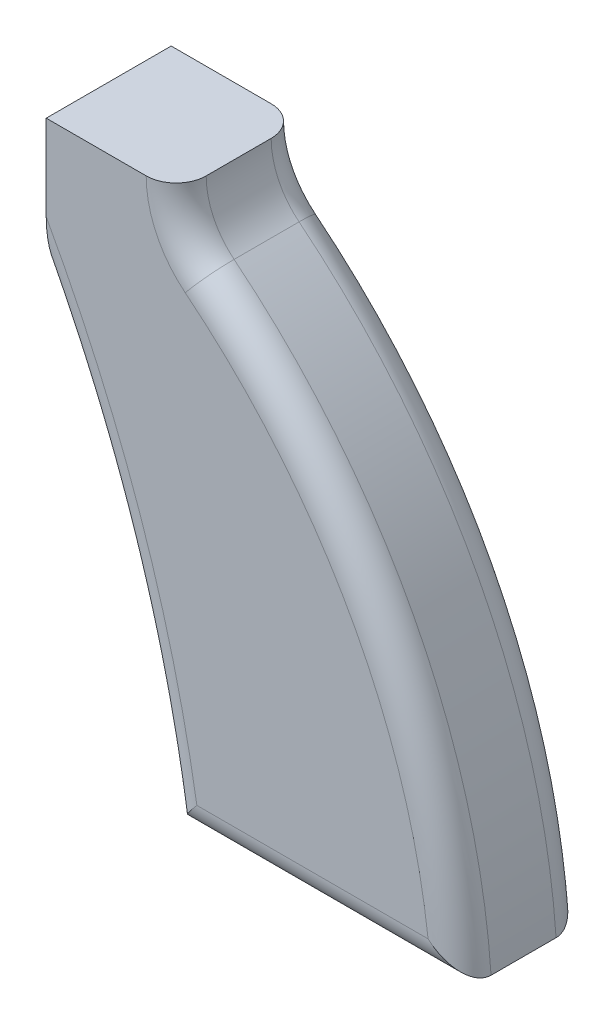
ISO-10303-21;
HEADER;
FILE_DESCRIPTION(('STEP AP214'),'2;1');
FILE_NAME('part.step','',(''),(''),'','','');
FILE_SCHEMA(('AUTOMOTIVE_DESIGN { 1 0 10303 214 1 1 1 1 }'));
ENDSEC;
DATA;
#1=APPLICATION_CONTEXT('core data for automotive mechanical design processes');
#2=APPLICATION_PROTOCOL_DEFINITION('international standard','automotive_design',2000,#1);
#3=PRODUCT_CONTEXT('',#1,'mechanical');
#4=PRODUCT('Part','Part','',(#3));
#5=PRODUCT_RELATED_PRODUCT_CATEGORY('part','',(#4));
#6=PRODUCT_DEFINITION_FORMATION('','',#4);
#7=PRODUCT_DEFINITION_CONTEXT('part definition',#1,'design');
#8=PRODUCT_DEFINITION('design','',#6,#7);
#9=PRODUCT_DEFINITION_SHAPE('','',#8);
#10=(LENGTH_UNIT() NAMED_UNIT(*) SI_UNIT(.MILLI.,.METRE.));
#11=(NAMED_UNIT(*) PLANE_ANGLE_UNIT() SI_UNIT($,.RADIAN.));
#12=(NAMED_UNIT(*) SI_UNIT($,.STERADIAN.) SOLID_ANGLE_UNIT());
#13=UNCERTAINTY_MEASURE_WITH_UNIT(LENGTH_MEASURE(1.E-05),#10,'distance_accuracy_value','');
#14=(GEOMETRIC_REPRESENTATION_CONTEXT(3) GLOBAL_UNCERTAINTY_ASSIGNED_CONTEXT((#13)) GLOBAL_UNIT_ASSIGNED_CONTEXT((#10,
#11,#12)) REPRESENTATION_CONTEXT('',''));
#15=CARTESIAN_POINT('',(0.,0.,0.));
#16=DIRECTION('',(0.,0.,1.));
#17=DIRECTION('',(1.,0.,0.));
#18=AXIS2_PLACEMENT_3D('',#15,#16,#17);
#19=CARTESIAN_POINT('',(0.,-30.,12.5));
#20=DIRECTION('',(1.,0.,0.));
#21=DIRECTION('',(0.,0.,-1.));
#22=AXIS2_PLACEMENT_3D('',#19,#20,#21);
#23=PLANE('',#22);
#24=DIRECTION('',(0.,-1.,0.));
#25=VECTOR('',#24,1.);
#26=CARTESIAN_POINT('',(0.,-30.,-12.5));
#27=LINE('',#26,#25);
#28=CARTESIAN_POINT('',(0.,0.,-12.5));
#29=VERTEX_POINT('',#28);
#30=CARTESIAN_POINT('',(0.,-17.0849348626977,-12.5));
#31=VERTEX_POINT('',#30);
#32=EDGE_CURVE('E165',#29,#31,#27,.T.);
#33=ORIENTED_EDGE('',*,*,#32,.T.);
#34=CARTESIAN_POINT('',(0.,-17.0849348626977,-12.5));
#35=CARTESIAN_POINT('',(0.,-17.4287398376187,-12.499964857327));
#36=CARTESIAN_POINT('',(0.,-17.772544136932,-12.4930974706652));
#37=CARTESIAN_POINT('',(0.,-18.4596490059866,-12.4656947226758));
#38=CARTESIAN_POINT('',(0.,-18.8029495099366,-12.4451577121361));
#39=CARTESIAN_POINT('',(0.,-19.4901663575468,-12.3902760598332));
#40=CARTESIAN_POINT('',(0.,-19.8340772683225,-12.3558632344532));
#41=CARTESIAN_POINT('',(0.,-20.5201900464618,-12.2729656249962));
#42=CARTESIAN_POINT('',(0.,-20.862391986659,-12.224481445914));
#43=CARTESIAN_POINT('',(0.,-21.547042465274,-12.1125222079461));
#44=CARTESIAN_POINT('',(0.,-21.8894727381152,-12.0489349483442));
#45=CARTESIAN_POINT('',(0.,-22.5710656109859,-11.9061789652204));
#46=CARTESIAN_POINT('',(0.,-22.9102284323369,-11.8270113049348));
#47=CARTESIAN_POINT('',(0.,-23.583534152316,-11.6521018380383));
#48=CARTESIAN_POINT('',(0.,-23.9176858731499,-11.5563941397362));
#49=CARTESIAN_POINT('',(0.,-24.5801347438927,-11.3466787277959));
#50=CARTESIAN_POINT('',(0.,-24.9084341099137,-11.2326781120384));
#51=CARTESIAN_POINT('',(0.,-25.4016496268041,-11.0436246746056));
#52=CARTESIAN_POINT('',(0.,-25.5694654855614,-10.9760887860326));
#53=CARTESIAN_POINT('',(0.,-25.9025502101817,-10.8349755540914));
#54=CARTESIAN_POINT('',(0.,-26.0678190865117,-10.761398235559));
#55=CARTESIAN_POINT('',(0.,-26.3954038651479,-10.6076457911366));
#56=CARTESIAN_POINT('',(0.,-26.5577177109601,-10.5274662699399));
#57=CARTESIAN_POINT('',(0.,-26.878615233802,-10.3599394457278));
#58=CARTESIAN_POINT('',(0.,-27.0371989862531,-10.2725922878002));
#59=CARTESIAN_POINT('',(0.,-27.3510115899447,-10.0892715769328));
#60=CARTESIAN_POINT('',(0.,-27.5062039149306,-9.99323517198079));
#61=CARTESIAN_POINT('',(0.,-27.8107686139016,-9.79221487530887));
#62=CARTESIAN_POINT('',(0.,-27.9601396694018,-9.6872289735438));
#63=CARTESIAN_POINT('',(0.,-28.2510677309912,-9.46752980171293));
#64=CARTESIAN_POINT('',(0.,-28.3926419383914,-9.35283948743589));
#65=CARTESIAN_POINT('',(0.,-28.6660108553798,-9.11242300898655));
#66=CARTESIAN_POINT('',(0.,-28.79781220261,-8.98670446416126));
#67=CARTESIAN_POINT('',(0.,-29.0596664673177,-8.71136108977418));
#68=CARTESIAN_POINT('',(0.,-29.1885467081913,-8.5606062046549));
#69=CARTESIAN_POINT('',(0.,-29.425639526051,-8.24306031000025));
#70=CARTESIAN_POINT('',(0.,-29.5338409002036,-8.07626068132197));
#71=CARTESIAN_POINT('',(0.,-29.6754109447137,-7.81314712460076));
#72=CARTESIAN_POINT('',(0.,-29.7194134112135,-7.72250742893393));
#73=CARTESIAN_POINT('',(0.,-29.7988862873725,-7.53758645519352));
#74=CARTESIAN_POINT('',(0.,-29.8343622791027,-7.44330760676858));
#75=CARTESIAN_POINT('',(0.,-29.8955878756046,-7.25197545594446));
#76=CARTESIAN_POINT('',(0.,-29.9213696996636,-7.15493251822402));
#77=CARTESIAN_POINT('',(0.,-29.9624024631607,-6.95869841630696));
#78=CARTESIAN_POINT('',(0.,-29.977663947432,-6.85950950626169));
#79=CARTESIAN_POINT('',(0.,-29.991568163043,-6.71664471275733));
#80=CARTESIAN_POINT('',(0.,-29.9947274275823,-6.67337281202949));
#81=CARTESIAN_POINT('',(0.,-29.9989435790027,-6.58673689248806));
#82=CARTESIAN_POINT('',(0.,-30.0000009546664,-6.54337289743909));
#83=CARTESIAN_POINT('',(0.,-30.,-6.5));
#84=B_SPLINE_CURVE_WITH_KNOTS('',3,(#34,#35,#36,#37,#38,#39,#40,#41,#42,#43,#44,#45,#46,#47,#48,
#49,#50,#51,#52,#53,#54,#55,#56,#57,#58,#59,#60,#61,#62,#63,#64,#65,#66,#67,#68,#69,#70,#71,#72,
#73,#74,#75,#76,#77,#78,#79,#80,#81,#82,#83),.UNSPECIFIED.,.F.,.F.,(4,2,2,2,2,2,2,2,2,2,2,2,2,2,
2,2,2,2,2,2,2,2,2,2,4),(0.,1.03134679479289,2.06281804202376,3.09942077949293,4.13597895504777,
5.18049283861224,6.22493546725953,7.26724943652863,8.30915994857089,8.85175058505895,
9.39433899112628,9.93729158300139,10.4802331871009,11.0274756335777,11.5748413154655,
12.1209465838831,12.6666774787095,13.2603920979104,13.8544274575025,14.15634330919,
14.45806096237,14.7587667796314,15.059170750993,15.1892893164207,15.3193776199496),.UNSPECIFIED.);
#85=CARTESIAN_POINT('',(0.,-30.,-6.5));
#86=VERTEX_POINT('',#85);
#87=EDGE_CURVE('E69',#31,#86,#84,.T.);
#88=ORIENTED_EDGE('',*,*,#87,.T.);
#89=DIRECTION('',(0.,0.,-1.));
#90=VECTOR('',#89,1.);
#91=CARTESIAN_POINT('',(0.,-30.,12.5));
#92=LINE('',#91,#90);
#93=CARTESIAN_POINT('',(0.,-30.,6.5));
#94=VERTEX_POINT('',#93);
#95=EDGE_CURVE('E185',#94,#86,#92,.T.);
#96=ORIENTED_EDGE('',*,*,#95,.F.);
#97=CARTESIAN_POINT('',(0.,-30.,6.5));
#98=CARTESIAN_POINT('',(0.,-30.0000364320018,6.58242600891991));
#99=CARTESIAN_POINT('',(0.,-29.9961882591375,6.66483119667377));
#100=CARTESIAN_POINT('',(0.,-29.9810059615345,6.82885553646271));
#101=CARTESIAN_POINT('',(0.,-29.9696805550791,6.91047549174702));
#102=CARTESIAN_POINT('',(0.,-29.9399961647843,7.07145621556594));
#103=CARTESIAN_POINT('',(0.,-29.9217189072021,7.15083213540408));
#104=CARTESIAN_POINT('',(0.,-29.8786064167526,7.30778374872319));
#105=CARTESIAN_POINT('',(0.,-29.8537689788709,7.38535882734797));
#106=CARTESIAN_POINT('',(0.,-29.7563989052975,7.65267672354226));
#107=CARTESIAN_POINT('',(0.,-29.6680579098604,7.83680172177315));
#108=CARTESIAN_POINT('',(0.,-29.4628478012253,8.18892117514026));
#109=CARTESIAN_POINT('',(0.,-29.3458403546669,8.35683173740926));
#110=CARTESIAN_POINT('',(0.,-29.11598012687,8.64528374717716));
#111=CARTESIAN_POINT('',(0.,-29.0066798282084,8.76871466651011));
#112=CARTESIAN_POINT('',(0.,-28.7777376861709,9.00565890586628));
#113=CARTESIAN_POINT('',(0.,-28.6580890745272,9.11916563593832));
#114=CARTESIAN_POINT('',(0.,-28.4106933447741,9.33717948904083));
#115=CARTESIAN_POINT('',(0.,-28.2829375853778,9.44167671946444));
#116=CARTESIAN_POINT('',(0.,-28.0210860185258,9.64245664985966));
#117=CARTESIAN_POINT('',(0.,-27.8869877600234,9.73873613311593));
#118=CARTESIAN_POINT('',(0.,-27.6159694888988,9.92233455112756));
#119=CARTESIAN_POINT('',(0.,-27.479130154285,10.0097731938313));
#120=CARTESIAN_POINT('',(0.,-27.2014625572109,10.1780926582359));
#121=CARTESIAN_POINT('',(0.,-27.0606335037897,10.2589721671393));
#122=CARTESIAN_POINT('',(0.,-26.6330600023027,10.4927361888604));
#123=CARTESIAN_POINT('',(0.,-26.3413846611174,10.6366434293452));
#124=CARTESIAN_POINT('',(0.,-25.7474771049853,10.9046940843963));
#125=CARTESIAN_POINT('',(0.,-25.4451990093105,11.0287340022273));
#126=CARTESIAN_POINT('',(0.,-24.8339953227157,11.2587567868532));
#127=CARTESIAN_POINT('',(0.,-24.5250718410137,11.3647452905603));
#128=CARTESIAN_POINT('',(0.,-23.9225875715503,11.5541756592394));
#129=CARTESIAN_POINT('',(0.,-23.6293451112439,11.6386393442575));
#130=CARTESIAN_POINT('',(0.,-23.0394030889767,11.794615008311));
#131=CARTESIAN_POINT('',(0.,-22.7427030243648,11.8661250785647));
#132=CARTESIAN_POINT('',(0.,-22.1463563487155,11.9970735814779));
#133=CARTESIAN_POINT('',(0.,-21.8467071181236,12.0565000279624));
#134=CARTESIAN_POINT('',(0.,-21.2453446560197,12.1637954246969));
#135=CARTESIAN_POINT('',(0.,-20.9436313653175,12.2116640420674));
#136=CARTESIAN_POINT('',(0.,-20.3463556930911,12.2951781840294));
#137=CARTESIAN_POINT('',(0.,-20.0508323351537,12.3311039344539));
#138=CARTESIAN_POINT('',(0.,-19.4587095752775,12.3926080957939));
#139=CARTESIAN_POINT('',(0.,-19.1621101611102,12.4181863887436));
#140=CARTESIAN_POINT('',(0.,-18.5689155649904,12.4590679319556));
#141=CARTESIAN_POINT('',(0.,-18.2723220596588,12.4743955397528));
#142=CARTESIAN_POINT('',(0.,-17.6787977051132,12.4948515866828));
#143=CARTESIAN_POINT('',(0.,-17.3818668726013,12.4999805104984));
#144=CARTESIAN_POINT('',(0.,-17.0849348626977,12.5));
#145=B_SPLINE_CURVE_WITH_KNOTS('',3,(#97,#98,#99,#100,#101,#102,#103,#104,#105,#106,#107,#108,
#109,#110,#111,#112,#113,#114,#115,#116,#117,#118,#119,#120,#121,#122,#123,#124,#125,#126,#127,
#128,#129,#130,#131,#132,#133,#134,#135,#136,#137,#138,#139,#140,#141,#142,#143,#144),
.UNSPECIFIED.,.F.,.F.,(4,2,2,2,2,2,2,2,2,2,2,2,2,2,2,2,2,2,2,2,2,2,2,4),(0.,0.247154512361413,
0.494021355951402,0.738071492661664,0.982203764372273,1.59116361114361,2.20312203795052,
2.69703334892269,3.19127017927436,3.68604295778755,4.18100852797524,4.66797135398486,
5.15503140531173,6.12970861207052,7.10930883082825,8.08860258687865,9.00378284530712,
9.91909785074081,10.8353164074219,11.7515613491589,12.6444735556612,13.537395941483,
14.4281889665643,15.3189396565392),.UNSPECIFIED.);
#146=CARTESIAN_POINT('',(0.,-17.0849348626977,12.5));
#147=VERTEX_POINT('',#146);
#148=EDGE_CURVE('E161',#94,#147,#145,.T.);
#149=ORIENTED_EDGE('',*,*,#148,.T.);
#150=DIRECTION('',(0.,-1.,0.));
#151=VECTOR('',#150,1.);
#152=CARTESIAN_POINT('',(0.,-30.,12.5));
#153=LINE('',#152,#151);
#154=CARTESIAN_POINT('',(0.,0.,12.5));
#155=VERTEX_POINT('',#154);
#156=EDGE_CURVE('E143',#155,#147,#153,.T.);
#157=ORIENTED_EDGE('',*,*,#156,.F.);
#158=DIRECTION('',(0.,0.,-1.));
#159=VECTOR('',#158,1.);
#160=CARTESIAN_POINT('',(0.,0.,12.5));
#161=LINE('',#160,#159);
#162=EDGE_CURVE('E149',#155,#29,#161,.T.);
#163=ORIENTED_EDGE('',*,*,#162,.T.);
#164=EDGE_LOOP('',(#33,#88,#96,#149,#157,#163));
#165=FACE_BOUND('',#164,.T.);
#166=ADVANCED_FACE('F45',(#165),#23,.F.);
#167=CARTESIAN_POINT('',(-237.254327688808,-148.048227402752,12.5));
#168=DIRECTION('',(0.,0.,-1.));
#169=DIRECTION('',(-1.,0.,0.));
#170=AXIS2_PLACEMENT_3D('',#167,#168,#169);
#171=CYLINDRICAL_SURFACE('',#170,265.);
#172=ORIENTED_EDGE('',*,*,#95,.T.);
#173=CARTESIAN_POINT('',(-237.254327688808,-148.048227402752,-6.5));
#174=DIRECTION('',(0.,0.,1.));
#175=DIRECTION('',(1.,0.,0.));
#176=AXIS2_PLACEMENT_3D('',#173,#174,#175);
#177=CIRCLE('',#176,265.);
#178=CARTESIAN_POINT('',(25.,-110.,-6.5));
#179=VERTEX_POINT('',#178);
#180=EDGE_CURVE('E232',#86,#179,#177,.F.);
#181=ORIENTED_EDGE('',*,*,#180,.T.);
#182=DIRECTION('',(0.,0.,-1.));
#183=VECTOR('',#182,1.);
#184=CARTESIAN_POINT('',(25.,-110.,12.5));
#185=LINE('',#184,#183);
#186=CARTESIAN_POINT('',(25.,-110.,6.5));
#187=VERTEX_POINT('',#186);
#188=EDGE_CURVE('E181',#187,#179,#185,.T.);
#189=ORIENTED_EDGE('',*,*,#188,.F.);
#190=CARTESIAN_POINT('',(-237.254327688808,-148.048227402752,6.5));
#191=DIRECTION('',(0.,0.,1.));
#192=DIRECTION('',(1.,0.,0.));
#193=AXIS2_PLACEMENT_3D('',#190,#191,#192);
#194=CIRCLE('',#193,265.);
#195=EDGE_CURVE('E76',#187,#94,#194,.T.);
#196=ORIENTED_EDGE('',*,*,#195,.T.);
#197=EDGE_LOOP('',(#172,#181,#189,#196));
#198=FACE_BOUND('',#197,.T.);
#199=ADVANCED_FACE('F252',(#198),#171,.F.);
#200=CARTESIAN_POINT('',(83.,-110.,12.5));
#201=DIRECTION('',(0.,1.,0.));
#202=DIRECTION('',(0.,0.,1.));
#203=AXIS2_PLACEMENT_3D('',#200,#201,#202);
#204=PLANE('',#203);
#205=ORIENTED_EDGE('',*,*,#188,.T.);
#206=DIRECTION('',(1.,0.,0.));
#207=VECTOR('',#206,1.);
#208=CARTESIAN_POINT('',(83.,-110.,-6.5));
#209=LINE('',#208,#207);
#210=CARTESIAN_POINT('',(83.,-110.,-6.5));
#211=VERTEX_POINT('',#210);
#212=EDGE_CURVE('E227',#179,#211,#209,.T.);
#213=ORIENTED_EDGE('',*,*,#212,.T.);
#214=DIRECTION('',(0.,0.,-1.));
#215=VECTOR('',#214,1.);
#216=CARTESIAN_POINT('',(83.,-110.,12.5));
#217=LINE('',#216,#215);
#218=CARTESIAN_POINT('',(83.,-110.,6.5));
#219=VERTEX_POINT('',#218);
#220=EDGE_CURVE('E177',#219,#211,#217,.T.);
#221=ORIENTED_EDGE('',*,*,#220,.F.);
#222=DIRECTION('',(1.,0.,0.));
#223=VECTOR('',#222,1.);
#224=CARTESIAN_POINT('',(25.,-110.,6.5));
#225=LINE('',#224,#223);
#226=EDGE_CURVE('E224',#219,#187,#225,.F.);
#227=ORIENTED_EDGE('',*,*,#226,.T.);
#228=EDGE_LOOP('',(#205,#213,#221,#227));
#229=FACE_BOUND('',#228,.T.);
#230=ADVANCED_FACE('F328',(#229),#204,.F.);
#231=CARTESIAN_POINT('',(-55.6472038329479,-119.897114190762,12.5));
#232=DIRECTION('',(0.,0.,-1.));
#233=DIRECTION('',(-1.,0.,0.));
#234=AXIS2_PLACEMENT_3D('',#231,#232,#233);
#235=CYLINDRICAL_SURFACE('',#234,139.);
#236=ORIENTED_EDGE('',*,*,#220,.T.);
#237=CARTESIAN_POINT('',(-55.6472038329479,-119.897114190762,-6.5));
#238=DIRECTION('',(0.,0.,1.));
#239=DIRECTION('',(1.,0.,0.));
#240=AXIS2_PLACEMENT_3D('',#237,#238,#239);
#241=CIRCLE('',#240,139.);
#242=CARTESIAN_POINT('',(31.5863113149726,-11.678290343256,-6.5));
#243=VERTEX_POINT('',#242);
#244=EDGE_CURVE('E11',#211,#243,#241,.T.);
#245=ORIENTED_EDGE('',*,*,#244,.T.);
#246=DIRECTION('',(0.,0.,-1.));
#247=VECTOR('',#246,1.);
#248=CARTESIAN_POINT('',(31.5863113149726,-11.678290343256,12.5));
#249=LINE('',#248,#247);
#250=CARTESIAN_POINT('',(31.5863113149726,-11.678290343256,6.5));
#251=VERTEX_POINT('',#250);
#252=EDGE_CURVE('E173',#251,#243,#249,.T.);
#253=ORIENTED_EDGE('',*,*,#252,.F.);
#254=CARTESIAN_POINT('',(-55.6472038329479,-119.897114190762,6.5));
#255=DIRECTION('',(0.,0.,1.));
#256=DIRECTION('',(1.,0.,0.));
#257=AXIS2_PLACEMENT_3D('',#254,#255,#256);
#258=CIRCLE('',#257,139.);
#259=EDGE_CURVE('E61',#251,#219,#258,.F.);
#260=ORIENTED_EDGE('',*,*,#259,.T.);
#261=EDGE_LOOP('',(#236,#245,#253,#260));
#262=FACE_BOUND('',#261,.T.);
#263=ADVANCED_FACE('F324',(#262),#235,.T.);
#264=CARTESIAN_POINT('',(41.,0.,12.5));
#265=DIRECTION('',(0.,0.,-1.));
#266=DIRECTION('',(-1.,0.,0.));
#267=AXIS2_PLACEMENT_3D('',#264,#265,#266);
#268=CYLINDRICAL_SURFACE('',#267,15.);
#269=ORIENTED_EDGE('',*,*,#252,.T.);
#270=CARTESIAN_POINT('',(41.,0.,-6.5));
#271=DIRECTION('',(0.,0.,1.));
#272=DIRECTION('',(1.,0.,0.));
#273=AXIS2_PLACEMENT_3D('',#270,#271,#272);
#274=CIRCLE('',#273,15.);
#275=CARTESIAN_POINT('',(26.,0.,-6.5));
#276=VERTEX_POINT('',#275);
#277=EDGE_CURVE('E191',#243,#276,#274,.F.);
#278=ORIENTED_EDGE('',*,*,#277,.T.);
#279=DIRECTION('',(0.,0.,-1.));
#280=VECTOR('',#279,1.);
#281=CARTESIAN_POINT('',(26.,0.,12.5));
#282=LINE('',#281,#280);
#283=CARTESIAN_POINT('',(26.,0.,6.5));
#284=VERTEX_POINT('',#283);
#285=EDGE_CURVE('E158',#284,#276,#282,.T.);
#286=ORIENTED_EDGE('',*,*,#285,.F.);
#287=CARTESIAN_POINT('',(41.,0.,6.5));
#288=DIRECTION('',(0.,0.,1.));
#289=DIRECTION('',(1.,0.,0.));
#290=AXIS2_PLACEMENT_3D('',#287,#288,#289);
#291=CIRCLE('',#290,15.);
#292=EDGE_CURVE('E188',#284,#251,#291,.T.);
#293=ORIENTED_EDGE('',*,*,#292,.T.);
#294=EDGE_LOOP('',(#269,#278,#286,#293));
#295=FACE_BOUND('',#294,.T.);
#296=ADVANCED_FACE('F402',(#295),#268,.F.);
#297=CARTESIAN_POINT('',(0.,0.,12.5));
#298=DIRECTION('',(0.,-1.,0.));
#299=DIRECTION('',(0.,0.,-1.));
#300=AXIS2_PLACEMENT_3D('',#297,#298,#299);
#301=PLANE('',#300);
#302=ORIENTED_EDGE('',*,*,#285,.T.);
#303=CARTESIAN_POINT('',(20.,0.,-6.5));
#304=DIRECTION('',(0.,-1.,0.));
#305=DIRECTION('',(0.,0.,-1.));
#306=AXIS2_PLACEMENT_3D('',#303,#304,#305);
#307=CIRCLE('',#306,6.);
#308=CARTESIAN_POINT('',(20.,0.,-12.5));
#309=VERTEX_POINT('',#308);
#310=EDGE_CURVE('E198',#276,#309,#307,.F.);
#311=ORIENTED_EDGE('',*,*,#310,.T.);
#312=DIRECTION('',(-1.,0.,0.));
#313=VECTOR('',#312,1.);
#314=CARTESIAN_POINT('',(0.,0.,-12.5));
#315=LINE('',#314,#313);
#316=EDGE_CURVE('E155',#309,#29,#315,.T.);
#317=ORIENTED_EDGE('',*,*,#316,.T.);
#318=ORIENTED_EDGE('',*,*,#162,.F.);
#319=DIRECTION('',(-1.,0.,0.));
#320=VECTOR('',#319,1.);
#321=CARTESIAN_POINT('',(0.,0.,12.5));
#322=LINE('',#321,#320);
#323=CARTESIAN_POINT('',(20.,0.,12.5));
#324=VERTEX_POINT('',#323);
#325=EDGE_CURVE('E139',#324,#155,#322,.T.);
#326=ORIENTED_EDGE('',*,*,#325,.F.);
#327=CARTESIAN_POINT('',(20.,0.,6.5));
#328=DIRECTION('',(0.,-1.,0.));
#329=DIRECTION('',(0.,0.,-1.));
#330=AXIS2_PLACEMENT_3D('',#327,#328,#329);
#331=CIRCLE('',#330,6.);
#332=EDGE_CURVE('E195',#324,#284,#331,.F.);
#333=ORIENTED_EDGE('',*,*,#332,.T.);
#334=EDGE_LOOP('',(#302,#311,#317,#318,#326,#333));
#335=FACE_BOUND('',#334,.T.);
#336=ADVANCED_FACE('F153',(#335),#301,.F.);
#337=CARTESIAN_POINT('',(41.,0.,12.5));
#338=DIRECTION('',(0.,0.,1.));
#339=DIRECTION('',(1.,0.,0.));
#340=AXIS2_PLACEMENT_3D('',#337,#338,#339);
#341=PLANE('',#340);
#342=ORIENTED_EDGE('',*,*,#156,.T.);
#343=CARTESIAN_POINT('',(-237.254327688808,-148.048227402752,12.5));
#344=DIRECTION('',(0.,0.,1.));
#345=DIRECTION('',(1.,0.,0.));
#346=AXIS2_PLACEMENT_3D('',#343,#344,#345);
#347=CIRCLE('',#346,271.);
#348=CARTESIAN_POINT('',(30.1419207191972,-104.,12.5));
#349=VERTEX_POINT('',#348);
#350=EDGE_CURVE('E221',#147,#349,#347,.F.);
#351=ORIENTED_EDGE('',*,*,#350,.T.);
#352=DIRECTION('',(1.,0.,0.));
#353=VECTOR('',#352,1.);
#354=CARTESIAN_POINT('',(83.,-104.,12.5));
#355=LINE('',#354,#353);
#356=CARTESIAN_POINT('',(76.3993097916301,-104.,12.5));
#357=VERTEX_POINT('',#356);
#358=EDGE_CURVE('E216',#349,#357,#355,.T.);
#359=ORIENTED_EDGE('',*,*,#358,.T.);
#360=CARTESIAN_POINT('',(-55.6472038329479,-119.897114190762,12.5));
#361=DIRECTION('',(0.,0.,1.));
#362=DIRECTION('',(1.,0.,0.));
#363=AXIS2_PLACEMENT_3D('',#360,#361,#362);
#364=CIRCLE('',#363,133.);
#365=CARTESIAN_POINT('',(27.8208358409616,-16.3496064805584,12.5));
#366=VERTEX_POINT('',#365);
#367=EDGE_CURVE('E213',#357,#366,#364,.T.);
#368=ORIENTED_EDGE('',*,*,#367,.T.);
#369=CARTESIAN_POINT('',(41.,0.,12.5));
#370=DIRECTION('',(0.,0.,1.));
#371=DIRECTION('',(1.,0.,0.));
#372=AXIS2_PLACEMENT_3D('',#369,#370,#371);
#373=CIRCLE('',#372,21.);
#374=EDGE_CURVE('E146',#366,#324,#373,.F.);
#375=ORIENTED_EDGE('',*,*,#374,.T.);
#376=ORIENTED_EDGE('',*,*,#325,.T.);
#377=EDGE_LOOP('',(#342,#351,#359,#368,#375,#376));
#378=FACE_BOUND('',#377,.T.);
#379=ADVANCED_FACE('F141',(#378),#341,.T.);
#380=CARTESIAN_POINT('',(41.,0.,-12.5));
#381=DIRECTION('',(0.,0.,1.));
#382=DIRECTION('',(1.,0.,0.));
#383=AXIS2_PLACEMENT_3D('',#380,#381,#382);
#384=PLANE('',#383);
#385=DIRECTION('',(1.,0.,0.));
#386=VECTOR('',#385,1.);
#387=CARTESIAN_POINT('',(41.,-104.,-12.5));
#388=LINE('',#387,#386);
#389=CARTESIAN_POINT('',(76.3993097916301,-104.,-12.5));
#390=VERTEX_POINT('',#389);
#391=CARTESIAN_POINT('',(30.1419207191972,-104.,-12.5));
#392=VERTEX_POINT('',#391);
#393=EDGE_CURVE('E204',#390,#392,#388,.F.);
#394=ORIENTED_EDGE('',*,*,#393,.T.);
#395=CARTESIAN_POINT('',(-237.254327688808,-148.048227402752,-12.5));
#396=DIRECTION('',(0.,0.,1.));
#397=DIRECTION('',(1.,0.,0.));
#398=AXIS2_PLACEMENT_3D('',#395,#396,#397);
#399=CIRCLE('',#398,271.);
#400=EDGE_CURVE('E210',#392,#31,#399,.T.);
#401=ORIENTED_EDGE('',*,*,#400,.T.);
#402=ORIENTED_EDGE('',*,*,#32,.F.);
#403=ORIENTED_EDGE('',*,*,#316,.F.);
#404=CARTESIAN_POINT('',(41.,0.,-12.5));
#405=DIRECTION('',(0.,0.,1.));
#406=DIRECTION('',(1.,0.,0.));
#407=AXIS2_PLACEMENT_3D('',#404,#405,#406);
#408=CIRCLE('',#407,21.);
#409=CARTESIAN_POINT('',(27.8208358409616,-16.3496064805584,-12.5));
#410=VERTEX_POINT('',#409);
#411=EDGE_CURVE('E207',#309,#410,#408,.T.);
#412=ORIENTED_EDGE('',*,*,#411,.T.);
#413=CARTESIAN_POINT('',(-55.6472038329479,-119.897114190762,-12.5));
#414=DIRECTION('',(0.,0.,1.));
#415=DIRECTION('',(1.,0.,0.));
#416=AXIS2_PLACEMENT_3D('',#413,#414,#415);
#417=CIRCLE('',#416,133.);
#418=EDGE_CURVE('E201',#410,#390,#417,.F.);
#419=ORIENTED_EDGE('',*,*,#418,.T.);
#420=EDGE_LOOP('',(#394,#401,#402,#403,#412,#419));
#421=FACE_BOUND('',#420,.T.);
#422=ADVANCED_FACE('F289',(#421),#384,.F.);
#423=CARTESIAN_POINT('',(-237.254327688808,-148.048227402752,-6.5));
#424=DIRECTION('',(0.,0.,1.));
#425=DIRECTION('',(1.,0.,0.));
#426=AXIS2_PLACEMENT_3D('',#423,#424,#425);
#427=TOROIDAL_SURFACE('',#426,271.,6.);
#428=ORIENTED_EDGE('',*,*,#87,.F.);
#429=ORIENTED_EDGE('',*,*,#400,.F.);
#430=CARTESIAN_POINT('',(25.,-110.,-6.5));
#431=CARTESIAN_POINT('',(24.9999712078026,-110.000032782585,-6.64007955577272));
#432=CARTESIAN_POINT('',(25.0042439401897,-109.995095899681,-6.78013999363762));
#433=CARTESIAN_POINT('',(25.0211760494163,-109.975529296403,-7.05898607387127));
#434=CARTESIAN_POINT('',(25.0338301418095,-109.96090568351,-7.19777246366182));
#435=CARTESIAN_POINT('',(25.0671881721543,-109.922351270964,-7.47201935504434));
#436=CARTESIAN_POINT('',(25.087833313919,-109.898488450773,-7.60749663751168));
#437=CARTESIAN_POINT('',(25.1367969479003,-109.84188426233,-7.87517300573892));
#438=CARTESIAN_POINT('',(25.1651162883119,-109.809141912662,-8.0073717273701));
#439=CARTESIAN_POINT('',(25.2288813199202,-109.73540279304,-8.26730194627125));
#440=CARTESIAN_POINT('',(25.2643089833042,-109.694426904245,-8.39504380365478));
#441=CARTESIAN_POINT('',(25.3417978774501,-109.604781086796,-8.64573567522941));
#442=CARTESIAN_POINT('',(25.3838616149537,-109.556108250645,-8.76868385665861));
#443=CARTESIAN_POINT('',(25.5193151655396,-109.399328646716,-9.12984070777899));
#444=CARTESIAN_POINT('',(25.6219092299253,-109.280527920121,-9.36013048527589));
#445=CARTESIAN_POINT('',(25.8099152237911,-109.062669184113,-9.72469369898075));
#446=CARTESIAN_POINT('',(25.8899427335091,-108.969896511894,-9.86570401056218));
#447=CARTESIAN_POINT('',(26.057727597952,-108.775292598502,-10.136530574414));
#448=CARTESIAN_POINT('',(26.1454871639209,-108.673458765899,-10.2663436032986));
#449=CARTESIAN_POINT('',(26.3276789785743,-108.461934123386,-10.5146972567362));
#450=CARTESIAN_POINT('',(26.4221195914937,-108.352233462283,-10.6332232993343));
#451=CARTESIAN_POINT('',(26.6165415254915,-108.126267743038,-10.8588328306764));
#452=CARTESIAN_POINT('',(26.7165234264913,-108.010001997805,-10.9659151183312));
#453=CARTESIAN_POINT('',(27.0843553201522,-107.582003812123,-11.3305088316905));
#454=CARTESIAN_POINT('',(27.3659310281364,-107.253898795742,-11.5559556247007));
#455=CARTESIAN_POINT('',(27.8022473756913,-106.7446077901,-11.8390094184608));
#456=CARTESIAN_POINT('',(27.9501386754466,-106.571839773827,-11.9242218349353));
#457=CARTESIAN_POINT('',(28.249637277212,-106.221662735423,-12.0767932872269));
#458=CARTESIAN_POINT('',(28.4012438648892,-106.044254605006,-12.1441557260631));
#459=CARTESIAN_POINT('',(28.812547486831,-105.562530763339,-12.3017187159016));
#460=CARTESIAN_POINT('',(29.0747583051822,-105.254983087264,-12.3756835101991));
#461=CARTESIAN_POINT('',(29.6020791277001,-104.635556131479,-12.4744583535988));
#462=CARTESIAN_POINT('',(29.8671819567808,-104.323687206635,-12.4993704512646));
#463=CARTESIAN_POINT('',(30.135192681631,-104.00792694898,-12.4999960710226));
#464=CARTESIAN_POINT('',(30.1385567395079,-104.00396346604,-12.4999999982336));
#465=CARTESIAN_POINT('',(30.1419207191972,-104.,-12.5));
#466=B_SPLINE_CURVE_WITH_KNOTS('',3,(#430,#431,#432,#433,#434,#435,#436,#437,#438,#439,#440,
#441,#442,#443,#444,#445,#446,#447,#448,#449,#450,#451,#452,#453,#454,#455,#456,#457,#458,#459,
#460,#461,#462,#463,#464,#465),.UNSPECIFIED.,.F.,.F.,(4,2,2,2,2,2,2,2,2,2,2,2,2,2,2,2,2,4),(0.,
0.420056451043261,0.839848308346765,1.25660841870083,1.67341461049577,2.08917678309545,
2.50509638534944,3.33767046126989,3.89744815657888,4.45738646220607,5.01803862219852,
5.57874956825017,7.03255835732796,7.76065822016361,8.48861917395433,9.71807086539089,
10.9449621084617,10.9605580908233),.UNSPECIFIED.);
#467=EDGE_CURVE('E169',#179,#392,#466,.T.);
#468=ORIENTED_EDGE('',*,*,#467,.F.);
#469=ORIENTED_EDGE('',*,*,#180,.F.);
#470=EDGE_LOOP('',(#428,#429,#468,#469));
#471=FACE_BOUND('',#470,.T.);
#472=ADVANCED_FACE('F285',(#471),#427,.T.);
#473=CARTESIAN_POINT('',(83.,-104.,-6.5));
#474=DIRECTION('',(1.,0.,0.));
#475=DIRECTION('',(0.,0.,-1.));
#476=AXIS2_PLACEMENT_3D('',#473,#474,#475);
#477=CYLINDRICAL_SURFACE('',#476,6.);
#478=ORIENTED_EDGE('',*,*,#467,.T.);
#479=ORIENTED_EDGE('',*,*,#393,.F.);
#480=CARTESIAN_POINT('',(83.,-110.,-6.5));
#481=CARTESIAN_POINT('',(83.0000370990974,-110.000035426435,-6.63151471613233));
#482=CARTESIAN_POINT('',(82.9953580024259,-109.995677570263,-6.76300486129939));
#483=CARTESIAN_POINT('',(82.9768483467153,-109.978443359537,-7.02466776698364));
#484=CARTESIAN_POINT('',(82.9630256266909,-109.96557430181,-7.15484155906518));
#485=CARTESIAN_POINT('',(82.9266749824402,-109.931739619784,-7.41165843343615));
#486=CARTESIAN_POINT('',(82.9042274471622,-109.910848764975,-7.53832286898422));
#487=CARTESIAN_POINT('',(82.8511002132052,-109.861422378096,-7.78839845813984));
#488=CARTESIAN_POINT('',(82.8204192132528,-109.832885637618,-7.9118090941055));
#489=CARTESIAN_POINT('',(82.7515275202126,-109.768835447249,-8.15414394607635));
#490=CARTESIAN_POINT('',(82.7133435290827,-109.733346739645,-8.27308233976083));
#491=CARTESIAN_POINT('',(82.6300140633092,-109.655937334701,-8.50636315998435));
#492=CARTESIAN_POINT('',(82.5848657771376,-109.614014039713,-8.62070370673768));
#493=CARTESIAN_POINT('',(82.439805516828,-109.47939102008,-8.95651367933884));
#494=CARTESIAN_POINT('',(82.3303788736789,-109.377931911162,-9.17042716707847));
#495=CARTESIAN_POINT('',(82.0391719681829,-109.10831637149,-9.66471031676405));
#496=CARTESIAN_POINT('',(81.8466488677436,-108.930368552646,-9.93338154617612));
#497=CARTESIAN_POINT('',(81.5361264213883,-108.644057208758,-10.3022480620598));
#498=CARTESIAN_POINT('',(81.4288328207125,-108.545238664152,-10.4196518463304));
#499=CARTESIAN_POINT('',(81.2080826676485,-108.342177979493,-10.6434632722869));
#500=CARTESIAN_POINT('',(81.0946274469443,-108.23793701157,-10.7498732756951));
#501=CARTESIAN_POINT('',(80.8111269951393,-107.977801300366,-10.9968919263111));
#502=CARTESIAN_POINT('',(80.6382891460619,-107.819491574329,-11.131752288476));
#503=CARTESIAN_POINT('',(80.2842877743275,-107.495894756791,-11.3806145480969));
#504=CARTESIAN_POINT('',(80.1031204651625,-107.330604494831,-11.4946068394117));
#505=CARTESIAN_POINT('',(79.7341768512804,-106.994693388605,-11.7029716341663));
#506=CARTESIAN_POINT('',(79.5463933831586,-106.824066790555,-11.7973220570198));
#507=CARTESIAN_POINT('',(79.165932675969,-106.479107203777,-11.9672655145858));
#508=CARTESIAN_POINT('',(78.9732562603591,-106.304774839504,-12.0428616827811));
#509=CARTESIAN_POINT('',(78.5861142001416,-105.955258977729,-12.1755212497079));
#510=CARTESIAN_POINT('',(78.3916860274236,-105.780101664688,-12.2327633555094));
#511=CARTESIAN_POINT('',(78.0001615668345,-105.428161007059,-12.3304131384906));
#512=CARTESIAN_POINT('',(77.8030649731805,-105.251377476875,-12.3708188691853));
#513=CARTESIAN_POINT('',(77.2097408158648,-104.720397702131,-12.4674358562518));
#514=CARTESIAN_POINT('',(76.8104741431087,-104.364664899524,-12.4993824199998));
#515=CARTESIAN_POINT('',(76.4070646156911,-104.006877365446,-12.4999970386662));
#516=CARTESIAN_POINT('',(76.4031872144286,-104.003438615971,-12.4999999945897));
#517=CARTESIAN_POINT('',(76.3993097916301,-104.,-12.5));
#518=B_SPLINE_CURVE_WITH_KNOTS('',3,(#480,#481,#482,#483,#484,#485,#486,#487,#488,#489,#490,
#491,#492,#493,#494,#495,#496,#497,#498,#499,#500,#501,#502,#503,#504,#505,#506,#507,#508,#509,
#510,#511,#512,#513,#514,#515,#516,#517),.UNSPECIFIED.,.F.,.F.,(4,2,2,2,2,2,2,2,2,2,2,2,2,2,2,2,
2,2,4),(0.,0.394350023064291,0.788362399235983,1.17878807810844,1.5692754989237,
1.95839761602072,2.34767723719498,3.12733610825274,4.24698614432935,4.80836276236808,
5.3696185316692,6.17965466040951,6.99006273831751,7.80137698219352,8.61255557930293,
9.4155776290331,10.2186924919071,11.8207637510099,11.8363115186855),.UNSPECIFIED.);
#519=EDGE_CURVE('E267',#211,#390,#518,.T.);
#520=ORIENTED_EDGE('',*,*,#519,.F.);
#521=ORIENTED_EDGE('',*,*,#212,.F.);
#522=EDGE_LOOP('',(#478,#479,#520,#521));
#523=FACE_BOUND('',#522,.T.);
#524=ADVANCED_FACE('F263',(#523),#477,.T.);
#525=CARTESIAN_POINT('',(-55.6472038329479,-119.897114190762,-6.5));
#526=DIRECTION('',(0.,0.,1.));
#527=DIRECTION('',(1.,0.,0.));
#528=AXIS2_PLACEMENT_3D('',#525,#526,#527);
#529=TOROIDAL_SURFACE('',#528,133.,6.);
#530=ORIENTED_EDGE('',*,*,#519,.T.);
#531=ORIENTED_EDGE('',*,*,#418,.F.);
#532=CARTESIAN_POINT('',(27.8208358409616,-16.3496064805584,-6.5));
#533=DIRECTION('',(-0.778552689550402,0.627579245668493,0.));
#534=DIRECTION('',(-0.627579245668493,-0.778552689550402,0.));
#535=AXIS2_PLACEMENT_3D('',#532,#533,#534);
#536=CIRCLE('',#535,6.);
#537=EDGE_CURVE('E276',#243,#410,#536,.T.);
#538=ORIENTED_EDGE('',*,*,#537,.F.);
#539=ORIENTED_EDGE('',*,*,#244,.F.);
#540=EDGE_LOOP('',(#530,#531,#538,#539));
#541=FACE_BOUND('',#540,.T.);
#542=ADVANCED_FACE('F258',(#541),#529,.T.);
#543=CARTESIAN_POINT('',(41.,0.,-6.5));
#544=DIRECTION('',(0.,0.,1.));
#545=DIRECTION('',(1.,0.,0.));
#546=AXIS2_PLACEMENT_3D('',#543,#544,#545);
#547=TOROIDAL_SURFACE('',#546,21.,6.);
#548=ORIENTED_EDGE('',*,*,#537,.T.);
#549=ORIENTED_EDGE('',*,*,#411,.F.);
#550=ORIENTED_EDGE('',*,*,#310,.F.);
#551=ORIENTED_EDGE('',*,*,#277,.F.);
#552=EDGE_LOOP('',(#548,#549,#550,#551));
#553=FACE_BOUND('',#552,.T.);
#554=ADVANCED_FACE('F254',(#553),#547,.T.);
#555=CARTESIAN_POINT('',(-237.254327688808,-148.048227402752,6.5));
#556=DIRECTION('',(0.,0.,1.));
#557=DIRECTION('',(1.,0.,0.));
#558=AXIS2_PLACEMENT_3D('',#555,#556,#557);
#559=TOROIDAL_SURFACE('',#558,271.,6.);
#560=ORIENTED_EDGE('',*,*,#148,.F.);
#561=ORIENTED_EDGE('',*,*,#195,.F.);
#562=CARTESIAN_POINT('',(25.,-110.,6.5));
#563=CARTESIAN_POINT('',(24.9999712078026,-110.000032782585,6.64007955577271));
#564=CARTESIAN_POINT('',(25.0042439401897,-109.995095899681,6.78013999363762));
#565=CARTESIAN_POINT('',(25.0211760494163,-109.975529296403,7.05898607387127));
#566=CARTESIAN_POINT('',(25.0338301418095,-109.96090568351,7.19777246366182));
#567=CARTESIAN_POINT('',(25.0671881721543,-109.922351270964,7.47201935504433));
#568=CARTESIAN_POINT('',(25.087833313919,-109.898488450773,7.60749663751168));
#569=CARTESIAN_POINT('',(25.1367969479003,-109.84188426233,7.87517300573892));
#570=CARTESIAN_POINT('',(25.1651162883119,-109.809141912662,8.0073717273701));
#571=CARTESIAN_POINT('',(25.2288813199202,-109.73540279304,8.26730194627125));
#572=CARTESIAN_POINT('',(25.2643089833042,-109.694426904245,8.39504380365478));
#573=CARTESIAN_POINT('',(25.3417978774501,-109.604781086796,8.64573567522941));
#574=CARTESIAN_POINT('',(25.3838616149537,-109.556108250645,8.76868385665861));
#575=CARTESIAN_POINT('',(25.5193151655396,-109.399328646716,9.12984070777899));
#576=CARTESIAN_POINT('',(25.6219092299253,-109.280527920121,9.36013048527589));
#577=CARTESIAN_POINT('',(25.8099152237911,-109.062669184113,9.72469369898075));
#578=CARTESIAN_POINT('',(25.8899427335091,-108.969896511894,9.86570401056218));
#579=CARTESIAN_POINT('',(26.057727597952,-108.775292598502,10.136530574414));
#580=CARTESIAN_POINT('',(26.1454871639209,-108.673458765899,10.2663436032986));
#581=CARTESIAN_POINT('',(26.3276789785743,-108.461934123386,10.5146972567362));
#582=CARTESIAN_POINT('',(26.4221195914937,-108.352233462283,10.6332232993343));
#583=CARTESIAN_POINT('',(26.6165415254915,-108.126267743038,10.8588328306764));
#584=CARTESIAN_POINT('',(26.7165234264913,-108.010001997805,10.9659151183312));
#585=CARTESIAN_POINT('',(27.0843553201522,-107.582003812123,11.3305088316905));
#586=CARTESIAN_POINT('',(27.3659310281364,-107.253898795742,11.5559556247007));
#587=CARTESIAN_POINT('',(27.8022473756913,-106.7446077901,11.8390094184608));
#588=CARTESIAN_POINT('',(27.9501386754466,-106.571839773827,11.9242218349353));
#589=CARTESIAN_POINT('',(28.249637277212,-106.221662735423,12.0767932872269));
#590=CARTESIAN_POINT('',(28.4012438648892,-106.044254605006,12.1441557260631));
#591=CARTESIAN_POINT('',(28.812547486831,-105.562530763339,12.3017187159016));
#592=CARTESIAN_POINT('',(29.0747583051822,-105.254983087264,12.3756835101991));
#593=CARTESIAN_POINT('',(29.6020791277001,-104.635556131479,12.4744583535988));
#594=CARTESIAN_POINT('',(29.8671819567808,-104.323687206635,12.4993704512646));
#595=CARTESIAN_POINT('',(30.135192681631,-104.00792694898,12.4999960710226));
#596=CARTESIAN_POINT('',(30.1385567395079,-104.00396346604,12.4999999982336));
#597=CARTESIAN_POINT('',(30.1419207191972,-104.,12.5));
#598=B_SPLINE_CURVE_WITH_KNOTS('',3,(#562,#563,#564,#565,#566,#567,#568,#569,#570,#571,#572,
#573,#574,#575,#576,#577,#578,#579,#580,#581,#582,#583,#584,#585,#586,#587,#588,#589,#590,#591,
#592,#593,#594,#595,#596,#597),.UNSPECIFIED.,.F.,.F.,(4,2,2,2,2,2,2,2,2,2,2,2,2,2,2,2,2,4),(0.,
0.420056451043261,0.839848308346765,1.25660841870083,1.67341461049577,2.08917678309545,
2.50509638534944,3.33767046126989,3.89744815657888,4.45738646220607,5.0180386221985,
5.57874956825017,7.03255835732796,7.76065822016361,8.48861917395433,9.71807086539089,
10.9449621084617,10.9605580908233),.UNSPECIFIED.);
#599=EDGE_CURVE('E50',#349,#187,#598,.F.);
#600=ORIENTED_EDGE('',*,*,#599,.F.);
#601=ORIENTED_EDGE('',*,*,#350,.F.);
#602=EDGE_LOOP('',(#560,#561,#600,#601));
#603=FACE_BOUND('',#602,.T.);
#604=ADVANCED_FACE('F47',(#603),#559,.T.);
#605=CARTESIAN_POINT('',(41.,-104.,6.5));
#606=DIRECTION('',(-1.,0.,0.));
#607=DIRECTION('',(0.,0.,1.));
#608=AXIS2_PLACEMENT_3D('',#605,#606,#607);
#609=CYLINDRICAL_SURFACE('',#608,6.);
#610=ORIENTED_EDGE('',*,*,#599,.T.);
#611=ORIENTED_EDGE('',*,*,#226,.F.);
#612=CARTESIAN_POINT('',(83.,-110.,6.5));
#613=CARTESIAN_POINT('',(83.0000370990975,-110.000035426435,6.63151471613234));
#614=CARTESIAN_POINT('',(82.9953580024259,-109.995677570263,6.76300486129939));
#615=CARTESIAN_POINT('',(82.9768483467153,-109.978443359537,7.02466776698364));
#616=CARTESIAN_POINT('',(82.9630256266908,-109.96557430181,7.15484155906517));
#617=CARTESIAN_POINT('',(82.9266749824402,-109.931739619784,7.41165843343615));
#618=CARTESIAN_POINT('',(82.9042274471622,-109.910848764975,7.53832286898423));
#619=CARTESIAN_POINT('',(82.8511002132052,-109.861422378096,7.78839845813984));
#620=CARTESIAN_POINT('',(82.8204192132528,-109.832885637618,7.9118090941055));
#621=CARTESIAN_POINT('',(82.7515275202126,-109.768835447249,8.15414394607635));
#622=CARTESIAN_POINT('',(82.7133435290827,-109.733346739645,8.27308233976083));
#623=CARTESIAN_POINT('',(82.6300140633092,-109.655937334701,8.50636315998434));
#624=CARTESIAN_POINT('',(82.5848657771376,-109.614014039713,8.62070370673768));
#625=CARTESIAN_POINT('',(82.439805516828,-109.47939102008,8.95651367933884));
#626=CARTESIAN_POINT('',(82.3303788736789,-109.377931911162,9.17042716707846));
#627=CARTESIAN_POINT('',(82.0391719681829,-109.10831637149,9.66471031676405));
#628=CARTESIAN_POINT('',(81.8466488677435,-108.930368552646,9.93338154617612));
#629=CARTESIAN_POINT('',(81.5361264213883,-108.644057208758,10.3022480620598));
#630=CARTESIAN_POINT('',(81.4288328207125,-108.545238664152,10.4196518463303));
#631=CARTESIAN_POINT('',(81.2080826676485,-108.342177979493,10.6434632722869));
#632=CARTESIAN_POINT('',(81.0946274469442,-108.23793701157,10.7498732756951));
#633=CARTESIAN_POINT('',(80.8111269951393,-107.977801300366,10.9968919263111));
#634=CARTESIAN_POINT('',(80.6382891460619,-107.819491574329,11.131752288476));
#635=CARTESIAN_POINT('',(80.2842877743275,-107.495894756791,11.3806145480969));
#636=CARTESIAN_POINT('',(80.1031204651625,-107.330604494831,11.4946068394117));
#637=CARTESIAN_POINT('',(79.7341768512804,-106.994693388605,11.7029716341663));
#638=CARTESIAN_POINT('',(79.5463933831586,-106.824066790555,11.7973220570198));
#639=CARTESIAN_POINT('',(79.165932675969,-106.479107203777,11.9672655145858));
#640=CARTESIAN_POINT('',(78.973256260359,-106.304774839504,12.0428616827811));
#641=CARTESIAN_POINT('',(78.5861142001416,-105.955258977729,12.1755212497079));
#642=CARTESIAN_POINT('',(78.3916860274238,-105.780101664688,12.2327633555094));
#643=CARTESIAN_POINT('',(78.0001615668343,-105.428161007059,12.3304131384906));
#644=CARTESIAN_POINT('',(77.8030649731798,-105.251377476875,12.3708188691853));
#645=CARTESIAN_POINT('',(77.2097408158661,-104.720397702129,12.4674358562518));
#646=CARTESIAN_POINT('',(76.8104741431159,-104.364664899515,12.4993824199998));
#647=CARTESIAN_POINT('',(76.4070646156912,-104.006877365446,12.4999970386662));
#648=CARTESIAN_POINT('',(76.4031872144287,-104.003438615971,12.4999999945897));
#649=CARTESIAN_POINT('',(76.3993097916301,-104.,12.5));
#650=B_SPLINE_CURVE_WITH_KNOTS('',3,(#612,#613,#614,#615,#616,#617,#618,#619,#620,#621,#622,
#623,#624,#625,#626,#627,#628,#629,#630,#631,#632,#633,#634,#635,#636,#637,#638,#639,#640,#641,
#642,#643,#644,#645,#646,#647,#648,#649),.UNSPECIFIED.,.F.,.F.,(4,2,2,2,2,2,2,2,2,2,2,2,2,2,2,2,
2,2,4),(0.,0.394350023064292,0.788362399235985,1.17878807810845,1.5692754989237,
1.95839761602071,2.34767723719497,3.12733610825274,4.24698614432936,4.80836276236807,
5.36961853166921,6.17965466040951,6.9900627383175,7.80137698219352,8.61255557930295,
9.41557762903312,10.2186924919071,11.8207637510099,11.8363115186855),.UNSPECIFIED.);
#651=EDGE_CURVE('E302',#357,#219,#650,.F.);
#652=ORIENTED_EDGE('',*,*,#651,.F.);
#653=ORIENTED_EDGE('',*,*,#358,.F.);
#654=EDGE_LOOP('',(#610,#611,#652,#653));
#655=FACE_BOUND('',#654,.T.);
#656=ADVANCED_FACE('F296',(#655),#609,.T.);
#657=CARTESIAN_POINT('',(-55.6472038329479,-119.897114190762,6.5));
#658=DIRECTION('',(0.,0.,1.));
#659=DIRECTION('',(1.,0.,0.));
#660=AXIS2_PLACEMENT_3D('',#657,#658,#659);
#661=TOROIDAL_SURFACE('',#660,133.,6.);
#662=ORIENTED_EDGE('',*,*,#651,.T.);
#663=ORIENTED_EDGE('',*,*,#259,.F.);
#664=CARTESIAN_POINT('',(27.8208358409616,-16.3496064805584,6.5));
#665=DIRECTION('',(-0.778552689550402,0.627579245668493,0.));
#666=DIRECTION('',(-0.627579245668493,-0.778552689550402,0.));
#667=AXIS2_PLACEMENT_3D('',#664,#665,#666);
#668=CIRCLE('',#667,6.);
#669=EDGE_CURVE('E284',#366,#251,#668,.T.);
#670=ORIENTED_EDGE('',*,*,#669,.F.);
#671=ORIENTED_EDGE('',*,*,#367,.F.);
#672=EDGE_LOOP('',(#662,#663,#670,#671));
#673=FACE_BOUND('',#672,.T.);
#674=ADVANCED_FACE('F294',(#673),#661,.T.);
#675=CARTESIAN_POINT('',(41.,0.,6.5));
#676=DIRECTION('',(0.,0.,1.));
#677=DIRECTION('',(1.,0.,0.));
#678=AXIS2_PLACEMENT_3D('',#675,#676,#677);
#679=TOROIDAL_SURFACE('',#678,21.,6.);
#680=ORIENTED_EDGE('',*,*,#669,.T.);
#681=ORIENTED_EDGE('',*,*,#292,.F.);
#682=ORIENTED_EDGE('',*,*,#332,.F.);
#683=ORIENTED_EDGE('',*,*,#374,.F.);
#684=EDGE_LOOP('',(#680,#681,#682,#683));
#685=FACE_BOUND('',#684,.T.);
#686=ADVANCED_FACE('F291',(#685),#679,.T.);
#687=CLOSED_SHELL('',(#166,#199,#230,#263,#296,#336,#379,#422,#472,#524,#542,#554,#604,#656,
#674,#686));
#688=MANIFOLD_SOLID_BREP('B2',#687);
#689=ADVANCED_BREP_SHAPE_REPRESENTATION('',(#18,#688),#14);
#690=SHAPE_DEFINITION_REPRESENTATION(#9,#689);
ENDSEC;
END-ISO-10303-21;
